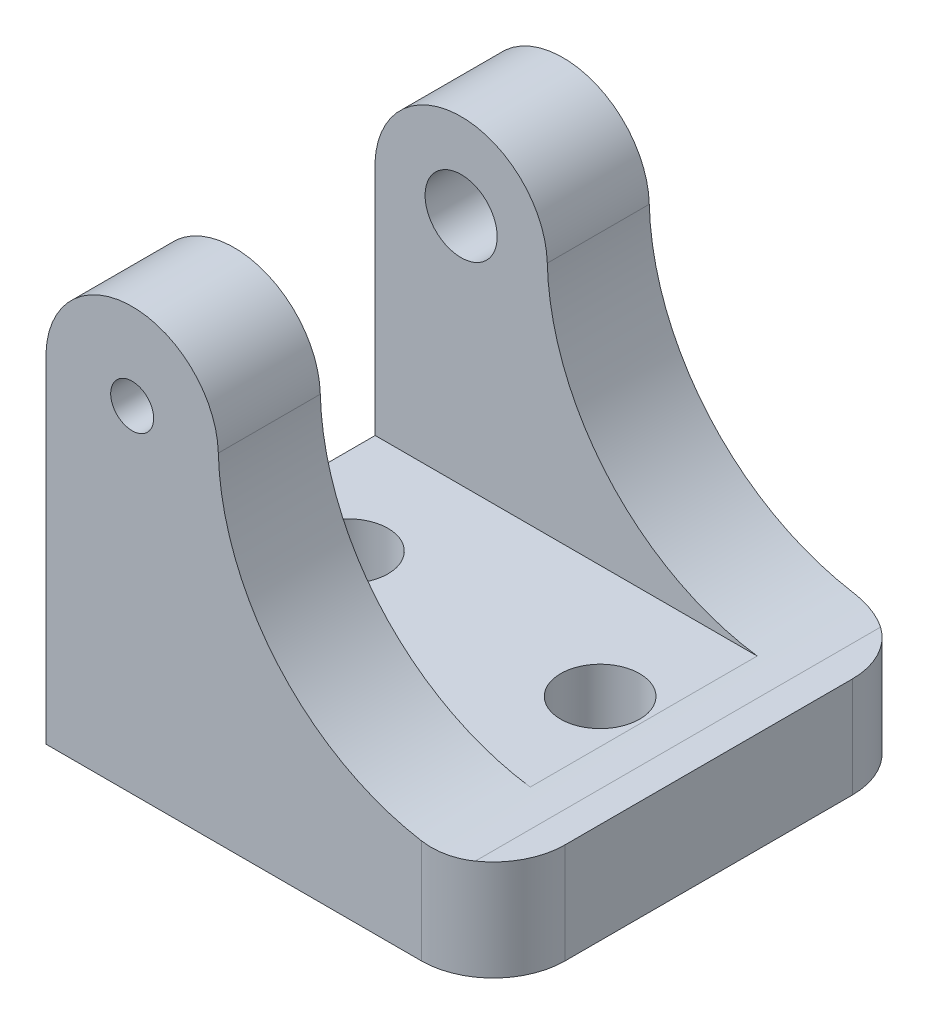
ISO-10303-21;
HEADER;
FILE_DESCRIPTION(('STEP AP214'),'2;1');
FILE_NAME('part.step','',(''),(''),'','','');
FILE_SCHEMA(('AUTOMOTIVE_DESIGN { 1 0 10303 214 1 1 1 1 }'));
ENDSEC;
DATA;
#1=APPLICATION_CONTEXT('core data for automotive mechanical design processes');
#2=APPLICATION_PROTOCOL_DEFINITION('international standard','automotive_design',2000,#1);
#3=PRODUCT_CONTEXT('',#1,'mechanical');
#4=PRODUCT('Part','Part','',(#3));
#5=PRODUCT_RELATED_PRODUCT_CATEGORY('part','',(#4));
#6=PRODUCT_DEFINITION_FORMATION('','',#4);
#7=PRODUCT_DEFINITION_CONTEXT('part definition',#1,'design');
#8=PRODUCT_DEFINITION('design','',#6,#7);
#9=PRODUCT_DEFINITION_SHAPE('','',#8);
#10=(LENGTH_UNIT() NAMED_UNIT(*) SI_UNIT(.MILLI.,.METRE.));
#11=(NAMED_UNIT(*) PLANE_ANGLE_UNIT() SI_UNIT($,.RADIAN.));
#12=(NAMED_UNIT(*) SI_UNIT($,.STERADIAN.) SOLID_ANGLE_UNIT());
#13=UNCERTAINTY_MEASURE_WITH_UNIT(LENGTH_MEASURE(1.E-05),#10,'distance_accuracy_value','');
#14=(GEOMETRIC_REPRESENTATION_CONTEXT(3) GLOBAL_UNCERTAINTY_ASSIGNED_CONTEXT((#13)) GLOBAL_UNIT_ASSIGNED_CONTEXT((#10,
#11,#12)) REPRESENTATION_CONTEXT('',''));
#15=CARTESIAN_POINT('',(0.,0.,0.));
#16=DIRECTION('',(0.,0.,1.));
#17=DIRECTION('',(1.,0.,0.));
#18=AXIS2_PLACEMENT_3D('',#15,#16,#17);
#19=CARTESIAN_POINT('',(-12.1624419840865,29.7023741953259,-38.1));
#20=DIRECTION('',(0.,0.,1.));
#21=DIRECTION('',(1.,0.,0.));
#22=AXIS2_PLACEMENT_3D('',#19,#20,#21);
#23=CYLINDRICAL_SURFACE('',#22,7.62);
#24=DIRECTION('',(0.,0.,1.));
#25=VECTOR('',#24,1.);
#26=CARTESIAN_POINT('',(-4.54514270780545,29.9052331008931,-38.1));
#27=LINE('',#26,#25);
#28=CARTESIAN_POINT('',(-4.54514270780545,29.9052331008931,-9.017));
#29=VERTEX_POINT('',#28);
#30=CARTESIAN_POINT('',(-4.54514270780545,29.9052331008931,0.));
#31=VERTEX_POINT('',#30);
#32=EDGE_CURVE('E193',#29,#31,#27,.T.);
#33=ORIENTED_EDGE('',*,*,#32,.F.);
#34=CARTESIAN_POINT('',(-12.1624419840865,29.7023741953259,-9.017));
#35=DIRECTION('',(0.,0.,1.));
#36=DIRECTION('',(0.,-1.,0.));
#37=AXIS2_PLACEMENT_3D('',#34,#35,#36);
#38=CIRCLE('',#37,7.62);
#39=CARTESIAN_POINT('',(-19.7612,29.1338,-9.017));
#40=VERTEX_POINT('',#39);
#41=EDGE_CURVE('E144',#40,#29,#38,.F.);
#42=ORIENTED_EDGE('',*,*,#41,.F.);
#43=DIRECTION('',(0.,0.,1.));
#44=VECTOR('',#43,1.);
#45=CARTESIAN_POINT('',(-19.7612,29.1338,-38.1));
#46=LINE('',#45,#44);
#47=CARTESIAN_POINT('',(-19.7612,29.1338,0.));
#48=VERTEX_POINT('',#47);
#49=EDGE_CURVE('E157',#40,#48,#46,.T.);
#50=ORIENTED_EDGE('',*,*,#49,.T.);
#51=CARTESIAN_POINT('',(-12.1624419840865,29.7023741953259,0.));
#52=DIRECTION('',(0.,0.,1.));
#53=DIRECTION('',(-1.,0.,0.));
#54=AXIS2_PLACEMENT_3D('',#51,#52,#53);
#55=CIRCLE('',#54,7.62);
#56=EDGE_CURVE('E170',#31,#48,#55,.T.);
#57=ORIENTED_EDGE('',*,*,#56,.F.);
#58=EDGE_LOOP('',(#33,#42,#50,#57));
#59=FACE_BOUND('',#58,.T.);
#60=ADVANCED_FACE('F40',(#59),#23,.T.);
#61=CARTESIAN_POINT('',(-19.7612,0.,-38.1));
#62=DIRECTION('',(-1.,0.,0.));
#63=DIRECTION('',(0.,0.,1.));
#64=AXIS2_PLACEMENT_3D('',#61,#62,#63);
#65=PLANE('',#64);
#66=DIRECTION('',(0.,-1.,0.));
#67=VECTOR('',#66,1.);
#68=CARTESIAN_POINT('',(-19.7612,0.,-29.083));
#69=LINE('',#68,#67);
#70=CARTESIAN_POINT('',(-19.7612,29.1338,-29.083));
#71=VERTEX_POINT('',#70);
#72=CARTESIAN_POINT('',(-19.7612,9.10297419532589,-29.083));
#73=VERTEX_POINT('',#72);
#74=EDGE_CURVE('E160',#71,#73,#69,.T.);
#75=ORIENTED_EDGE('',*,*,#74,.F.);
#76=CARTESIAN_POINT('',(-19.7612,29.1338,-38.1));
#77=VERTEX_POINT('',#76);
#78=EDGE_CURVE('E186',#77,#71,#46,.T.);
#79=ORIENTED_EDGE('',*,*,#78,.F.);
#80=DIRECTION('',(0.,-1.,0.));
#81=VECTOR('',#80,1.);
#82=CARTESIAN_POINT('',(-19.7612,0.,-38.1));
#83=LINE('',#82,#81);
#84=CARTESIAN_POINT('',(-19.7612,0.,-38.1));
#85=VERTEX_POINT('',#84);
#86=EDGE_CURVE('E166',#77,#85,#83,.T.);
#87=ORIENTED_EDGE('',*,*,#86,.T.);
#88=DIRECTION('',(0.,0.,1.));
#89=VECTOR('',#88,1.);
#90=CARTESIAN_POINT('',(-19.7612,0.,-38.1));
#91=LINE('',#90,#89);
#92=CARTESIAN_POINT('',(-19.7612,0.,0.));
#93=VERTEX_POINT('',#92);
#94=EDGE_CURVE('E177',#85,#93,#91,.T.);
#95=ORIENTED_EDGE('',*,*,#94,.T.);
#96=DIRECTION('',(0.,-1.,0.));
#97=VECTOR('',#96,1.);
#98=CARTESIAN_POINT('',(-19.7612,0.,0.));
#99=LINE('',#98,#97);
#100=EDGE_CURVE('E165',#48,#93,#99,.T.);
#101=ORIENTED_EDGE('',*,*,#100,.F.);
#102=ORIENTED_EDGE('',*,*,#49,.F.);
#103=DIRECTION('',(0.,1.,0.));
#104=VECTOR('',#103,1.);
#105=CARTESIAN_POINT('',(-19.7612,0.,-9.01699999999999));
#106=LINE('',#105,#104);
#107=CARTESIAN_POINT('',(-19.7612,9.10297419532589,-9.017));
#108=VERTEX_POINT('',#107);
#109=EDGE_CURVE('E148',#108,#40,#106,.T.);
#110=ORIENTED_EDGE('',*,*,#109,.F.);
#111=DIRECTION('',(0.,0.,1.));
#112=VECTOR('',#111,1.);
#113=CARTESIAN_POINT('',(-19.7612,9.10297419532589,-38.1));
#114=LINE('',#113,#112);
#115=EDGE_CURVE('E134',#73,#108,#114,.T.);
#116=ORIENTED_EDGE('',*,*,#115,.F.);
#117=EDGE_LOOP('',(#75,#79,#87,#95,#101,#102,#110,#116));
#118=FACE_BOUND('',#117,.T.);
#119=ADVANCED_FACE('F155',(#118),#65,.T.);
#120=CARTESIAN_POINT('',(-12.1624419840865,29.7023741953259,-29.083));
#121=DIRECTION('',(0.,0.,-1.));
#122=DIRECTION('',(-1.,0.,0.));
#123=AXIS2_PLACEMENT_3D('',#120,#121,#122);
#124=CIRCLE('',#123,7.62);
#125=CARTESIAN_POINT('',(-4.54514270780545,29.9052331008931,-29.083));
#126=VERTEX_POINT('',#125);
#127=EDGE_CURVE('E158',#126,#71,#124,.F.);
#128=ORIENTED_EDGE('',*,*,#127,.F.);
#129=CARTESIAN_POINT('',(-4.54514270780545,29.9052331008931,-38.1));
#130=VERTEX_POINT('',#129);
#131=EDGE_CURVE('E190',#130,#126,#27,.T.);
#132=ORIENTED_EDGE('',*,*,#131,.F.);
#133=CARTESIAN_POINT('',(-12.1624419840865,29.7023741953259,-38.1));
#134=DIRECTION('',(0.,0.,1.));
#135=DIRECTION('',(-1.,0.,0.));
#136=AXIS2_PLACEMENT_3D('',#133,#134,#135);
#137=CIRCLE('',#136,7.62);
#138=EDGE_CURVE('E174',#130,#77,#137,.T.);
#139=ORIENTED_EDGE('',*,*,#138,.T.);
#140=ORIENTED_EDGE('',*,*,#78,.T.);
#141=EDGE_LOOP('',(#128,#132,#139,#140));
#142=FACE_BOUND('',#141,.T.);
#143=ADVANCED_FACE('F249',(#142),#23,.T.);
#144=CARTESIAN_POINT('',(17.0372052416576,30.48,-38.1));
#145=DIRECTION('',(0.,0.,1.));
#146=DIRECTION('',(1.,0.,0.));
#147=AXIS2_PLACEMENT_3D('',#144,#145,#146);
#148=CYLINDRICAL_SURFACE('',#147,21.59);
#149=DIRECTION('',(0.,0.,1.));
#150=VECTOR('',#149,1.);
#151=CARTESIAN_POINT('',(17.0372052416576,8.89,-38.1));
#152=LINE('',#151,#150);
#153=CARTESIAN_POINT('',(17.0372052416576,8.89,-36.9629248975476));
#154=VERTEX_POINT('',#153);
#155=CARTESIAN_POINT('',(17.0372052416576,8.89,-1.1370751024524));
#156=VERTEX_POINT('',#155);
#157=EDGE_CURVE('E194',#154,#156,#152,.T.);
#158=ORIENTED_EDGE('',*,*,#157,.F.);
#159=CARTESIAN_POINT('',(17.0372052416576,8.89,-36.9629248975476));
#160=CARTESIAN_POINT('',(16.8931415028713,8.88998763684848,-37.063160770611));
#161=CARTESIAN_POINT('',(16.7448908878423,8.89144118584396,-37.157391085304));
#162=CARTESIAN_POINT('',(16.441141277506,8.89769845720492,-37.3332497352878));
#163=CARTESIAN_POINT('',(16.2856414930698,8.90250254510123,-37.4148766944144));
#164=CARTESIAN_POINT('',(15.9726522402385,8.91570640614745,-37.5629749658211));
#165=CARTESIAN_POINT('',(15.8153183028663,8.92400994811984,-37.6297837128549));
#166=CARTESIAN_POINT('',(15.496022299831,8.94448456826907,-37.750427239401));
#167=CARTESIAN_POINT('',(15.3340611026282,8.95665492499205,-37.8042644357979));
#168=CARTESIAN_POINT('',(15.0285847230403,8.98316744856153,-37.8923406938851));
#169=CARTESIAN_POINT('',(14.88550052542,8.99700124388347,-37.9282380772349));
#170=CARTESIAN_POINT('',(14.5975036183752,9.02779888671575,-37.9899415635191));
#171=CARTESIAN_POINT('',(14.4525909398653,9.04476268137232,-38.0157478368308));
#172=CARTESIAN_POINT('',(14.158378199001,9.08226849290067,-38.0576777652804));
#173=CARTESIAN_POINT('',(14.0090538461088,9.10288378645533,-38.0735652573884));
#174=CARTESIAN_POINT('',(13.7101272476129,9.14735785060343,-38.0947331159232));
#175=CARTESIAN_POINT('',(13.5605249869125,9.17121680280358,-38.1000128881811));
#176=CARTESIAN_POINT('',(13.4112,9.19666882305611,-38.1));
#177=B_SPLINE_CURVE_WITH_KNOTS('',3,(#159,#160,#161,#162,#163,#164,#165,#166,#167,#168,#169,
#170,#171,#172,#173,#174,#175,#176),.UNSPECIFIED.,.F.,.F.,(4,2,2,2,2,2,2,2,4),(0.,
0.526366836583321,1.05279110673478,1.56559737929597,2.0783080307723,2.5224270407601,
2.96653855195876,3.4208569174649,3.87520072993903),.UNSPECIFIED.);
#178=CARTESIAN_POINT('',(13.4112,9.19666882305611,-38.1));
#179=VERTEX_POINT('',#178);
#180=EDGE_CURVE('E237',#154,#179,#177,.T.);
#181=ORIENTED_EDGE('',*,*,#180,.T.);
#182=CARTESIAN_POINT('',(17.0372052416576,30.48,-38.1));
#183=DIRECTION('',(0.,0.,-1.));
#184=DIRECTION('',(1.,0.,0.));
#185=AXIS2_PLACEMENT_3D('',#182,#183,#184);
#186=CIRCLE('',#185,21.59);
#187=EDGE_CURVE('E172',#179,#130,#186,.T.);
#188=ORIENTED_EDGE('',*,*,#187,.T.);
#189=ORIENTED_EDGE('',*,*,#131,.T.);
#190=CARTESIAN_POINT('',(17.0372052416576,30.48,-29.083));
#191=DIRECTION('',(0.,0.,-1.));
#192=DIRECTION('',(-1.,0.,0.));
#193=AXIS2_PLACEMENT_3D('',#190,#191,#192);
#194=CIRCLE('',#193,21.59);
#195=CARTESIAN_POINT('',(14.0121651185686,9.10297419532591,-29.083));
#196=VERTEX_POINT('',#195);
#197=EDGE_CURVE('E205',#196,#126,#194,.T.);
#198=ORIENTED_EDGE('',*,*,#197,.F.);
#199=DIRECTION('',(0.,0.,1.));
#200=VECTOR('',#199,1.);
#201=CARTESIAN_POINT('',(14.0121651185686,9.10297419532591,-38.1));
#202=LINE('',#201,#200);
#203=CARTESIAN_POINT('',(14.0121651185686,9.10297419532591,-9.017));
#204=VERTEX_POINT('',#203);
#205=EDGE_CURVE('E189',#204,#196,#202,.F.);
#206=ORIENTED_EDGE('',*,*,#205,.F.);
#207=CARTESIAN_POINT('',(17.0372052416576,30.48,-9.017));
#208=DIRECTION('',(0.,0.,1.));
#209=DIRECTION('',(0.,-1.,0.));
#210=AXIS2_PLACEMENT_3D('',#207,#208,#209);
#211=CIRCLE('',#210,21.59);
#212=EDGE_CURVE('E151',#29,#204,#211,.T.);
#213=ORIENTED_EDGE('',*,*,#212,.F.);
#214=ORIENTED_EDGE('',*,*,#32,.T.);
#215=CARTESIAN_POINT('',(17.0372052416576,30.48,0.));
#216=DIRECTION('',(0.,0.,-1.));
#217=DIRECTION('',(1.,0.,0.));
#218=AXIS2_PLACEMENT_3D('',#215,#216,#217);
#219=CIRCLE('',#218,21.59);
#220=CARTESIAN_POINT('',(13.4112,9.19666882305611,0.));
#221=VERTEX_POINT('',#220);
#222=EDGE_CURVE('E182',#221,#31,#219,.T.);
#223=ORIENTED_EDGE('',*,*,#222,.F.);
#224=CARTESIAN_POINT('',(13.4112,9.19666882305611,0.));
#225=CARTESIAN_POINT('',(13.5842252192535,9.1671693741161,2.40591076720246E-05));
#226=CARTESIAN_POINT('',(13.7576277541459,9.13981899073767,-0.00707109032502442));
#227=CARTESIAN_POINT('',(14.1039145829073,9.08948163111424,-0.0355127757351594));
#228=CARTESIAN_POINT('',(14.2767988191825,9.06649512329994,-0.0568608405510777));
#229=CARTESIAN_POINT('',(14.6162910369309,9.02549427447236,-0.113084783871374));
#230=CARTESIAN_POINT('',(14.7829457028252,9.00736671812725,-0.147596529410407));
#231=CARTESIAN_POINT('',(15.1132933508516,8.97525221329142,-0.230004618226908));
#232=CARTESIAN_POINT('',(15.2769868749063,8.96126449981516,-0.277898485490002));
#233=CARTESIAN_POINT('',(15.5785685800954,8.93887206641993,-0.379503076486314));
#234=CARTESIAN_POINT('',(15.716975332757,8.92997038229936,-0.431574293600448));
#235=CARTESIAN_POINT('',(15.989947420612,8.9149811792621,-0.545310187399221));
#236=CARTESIAN_POINT('',(16.1245128163144,8.90889361599443,-0.606974712871384));
#237=CARTESIAN_POINT('',(16.3921188431343,8.89921495807326,-0.74112073697719));
#238=CARTESIAN_POINT('',(16.5250533609667,8.89568445161754,-0.813818259128751));
#239=CARTESIAN_POINT('',(16.785430981764,8.89107364016084,-0.968546394018817));
#240=CARTESIAN_POINT('',(16.9128737472261,8.88999348553936,-1.05057757924517));
#241=CARTESIAN_POINT('',(17.0372052416576,8.89,-1.1370751024524));
#242=B_SPLINE_CURVE_WITH_KNOTS('',3,(#224,#225,#226,#227,#228,#229,#230,#231,#232,#233,#234,
#235,#236,#237,#238,#239,#240,#241),.UNSPECIFIED.,.F.,.F.,(4,2,2,2,2,2,2,2,4),(0.,
0.52642632669727,1.05290912957047,1.56577610101067,2.07854824249167,2.52260711440877,
2.96665898765166,3.42091591287959,3.87520071536177),.UNSPECIFIED.);
#243=EDGE_CURVE('E230',#221,#156,#242,.T.);
#244=ORIENTED_EDGE('',*,*,#243,.T.);
#245=EDGE_LOOP('',(#158,#181,#188,#189,#198,#206,#213,#214,#223,#244));
#246=FACE_BOUND('',#245,.T.);
#247=ADVANCED_FACE('F243',(#246),#148,.F.);
#248=CARTESIAN_POINT('',(17.0372052416576,8.89,-38.1));
#249=DIRECTION('',(0.,1.,0.));
#250=DIRECTION('',(-1.,0.,0.));
#251=AXIS2_PLACEMENT_3D('',#248,#249,#250);
#252=PLANE('',#251);
#253=DIRECTION('',(0.,0.,1.));
#254=VECTOR('',#253,1.);
#255=CARTESIAN_POINT('',(19.7612,8.89,-38.1));
#256=LINE('',#255,#254);
#257=CARTESIAN_POINT('',(19.7612,8.89,-31.75));
#258=VERTEX_POINT('',#257);
#259=CARTESIAN_POINT('',(19.7612,8.89,-6.35000000000002));
#260=VERTEX_POINT('',#259);
#261=EDGE_CURVE('E197',#258,#260,#256,.T.);
#262=ORIENTED_EDGE('',*,*,#261,.F.);
#263=CARTESIAN_POINT('',(13.4112,8.89,-31.75));
#264=DIRECTION('',(0.,1.,0.));
#265=DIRECTION('',(-1.,0.,0.));
#266=AXIS2_PLACEMENT_3D('',#263,#264,#265);
#267=CIRCLE('',#266,6.35);
#268=EDGE_CURVE('E228',#258,#154,#267,.T.);
#269=ORIENTED_EDGE('',*,*,#268,.T.);
#270=ORIENTED_EDGE('',*,*,#157,.T.);
#271=CARTESIAN_POINT('',(13.4112,8.89,-6.35));
#272=DIRECTION('',(0.,1.,0.));
#273=DIRECTION('',(-1.,0.,0.));
#274=AXIS2_PLACEMENT_3D('',#271,#272,#273);
#275=CIRCLE('',#274,6.35);
#276=EDGE_CURVE('E226',#156,#260,#275,.T.);
#277=ORIENTED_EDGE('',*,*,#276,.T.);
#278=EDGE_LOOP('',(#262,#269,#270,#277));
#279=FACE_BOUND('',#278,.T.);
#280=ADVANCED_FACE('F248',(#279),#252,.T.);
#281=CARTESIAN_POINT('',(19.7612,8.89,-38.1));
#282=DIRECTION('',(1.,0.,0.));
#283=DIRECTION('',(0.,1.,0.));
#284=AXIS2_PLACEMENT_3D('',#281,#282,#283);
#285=PLANE('',#284);
#286=DIRECTION('',(0.,0.,1.));
#287=VECTOR('',#286,1.);
#288=CARTESIAN_POINT('',(19.7612,0.,-38.1));
#289=LINE('',#288,#287);
#290=CARTESIAN_POINT('',(19.7612,0.,-31.75));
#291=VERTEX_POINT('',#290);
#292=CARTESIAN_POINT('',(19.7612,0.,-6.35000000000002));
#293=VERTEX_POINT('',#292);
#294=EDGE_CURVE('E200',#291,#293,#289,.T.);
#295=ORIENTED_EDGE('',*,*,#294,.F.);
#296=DIRECTION('',(0.,1.,0.));
#297=VECTOR('',#296,1.);
#298=CARTESIAN_POINT('',(19.7612,8.89,-31.75));
#299=LINE('',#298,#297);
#300=EDGE_CURVE('E223',#291,#258,#299,.T.);
#301=ORIENTED_EDGE('',*,*,#300,.T.);
#302=ORIENTED_EDGE('',*,*,#261,.T.);
#303=DIRECTION('',(0.,1.,0.));
#304=VECTOR('',#303,1.);
#305=CARTESIAN_POINT('',(19.7612,0.,-6.35));
#306=LINE('',#305,#304);
#307=EDGE_CURVE('E208',#260,#293,#306,.F.);
#308=ORIENTED_EDGE('',*,*,#307,.T.);
#309=EDGE_LOOP('',(#295,#301,#302,#308));
#310=FACE_BOUND('',#309,.T.);
#311=ADVANCED_FACE('F255',(#310),#285,.T.);
#312=CARTESIAN_POINT('',(-19.7612,0.,-38.1));
#313=DIRECTION('',(0.,-1.,0.));
#314=DIRECTION('',(1.,0.,0.));
#315=AXIS2_PLACEMENT_3D('',#312,#313,#314);
#316=PLANE('',#315);
#317=CARTESIAN_POINT('',(10.16,0.,-19.05));
#318=DIRECTION('',(0.,-1.,0.));
#319=DIRECTION('',(1.,0.,0.));
#320=AXIS2_PLACEMENT_3D('',#317,#318,#319);
#321=CIRCLE('',#320,3.4925);
#322=CARTESIAN_POINT('',(13.6525,0.,-19.05));
#323=VERTEX_POINT('',#322);
#324=EDGE_CURVE('E221',#323,#323,#321,.T.);
#325=ORIENTED_EDGE('',*,*,#324,.F.);
#326=EDGE_LOOP('',(#325));
#327=FACE_BOUND('',#326,.T.);
#328=CARTESIAN_POINT('',(-12.0904,0.,-19.05));
#329=DIRECTION('',(0.,-1.,0.));
#330=DIRECTION('',(1.,0.,0.));
#331=AXIS2_PLACEMENT_3D('',#328,#329,#330);
#332=CIRCLE('',#331,3.4925);
#333=CARTESIAN_POINT('',(-8.5979,0.,-19.05));
#334=VERTEX_POINT('',#333);
#335=EDGE_CURVE('E217',#334,#334,#332,.T.);
#336=ORIENTED_EDGE('',*,*,#335,.F.);
#337=EDGE_LOOP('',(#336));
#338=FACE_BOUND('',#337,.T.);
#339=DIRECTION('',(1.,0.,0.));
#340=VECTOR('',#339,1.);
#341=CARTESIAN_POINT('',(-19.7612,0.,-38.1));
#342=LINE('',#341,#340);
#343=CARTESIAN_POINT('',(13.4112,0.,-38.1));
#344=VERTEX_POINT('',#343);
#345=EDGE_CURVE('E169',#85,#344,#342,.T.);
#346=ORIENTED_EDGE('',*,*,#345,.T.);
#347=CARTESIAN_POINT('',(13.4112,0.,-31.75));
#348=DIRECTION('',(0.,-1.,0.));
#349=DIRECTION('',(1.,0.,0.));
#350=AXIS2_PLACEMENT_3D('',#347,#348,#349);
#351=CIRCLE('',#350,6.35);
#352=EDGE_CURVE('E49',#344,#291,#351,.T.);
#353=ORIENTED_EDGE('',*,*,#352,.T.);
#354=ORIENTED_EDGE('',*,*,#294,.T.);
#355=CARTESIAN_POINT('',(13.4112,0.,-6.35));
#356=DIRECTION('',(0.,-1.,0.));
#357=DIRECTION('',(1.,0.,0.));
#358=AXIS2_PLACEMENT_3D('',#355,#356,#357);
#359=CIRCLE('',#358,6.35);
#360=CARTESIAN_POINT('',(13.4112,0.,0.));
#361=VERTEX_POINT('',#360);
#362=EDGE_CURVE('E56',#293,#361,#359,.T.);
#363=ORIENTED_EDGE('',*,*,#362,.T.);
#364=DIRECTION('',(1.,0.,0.));
#365=VECTOR('',#364,1.);
#366=CARTESIAN_POINT('',(-19.7612,0.,0.));
#367=LINE('',#366,#365);
#368=EDGE_CURVE('E180',#93,#361,#367,.T.);
#369=ORIENTED_EDGE('',*,*,#368,.F.);
#370=ORIENTED_EDGE('',*,*,#94,.F.);
#371=EDGE_LOOP('',(#346,#353,#354,#363,#369,#370));
#372=FACE_BOUND('',#371,.T.);
#373=ADVANCED_FACE('F259',(#327,#338,#372),#316,.T.);
#374=CARTESIAN_POINT('',(-12.1624419840865,29.7023741953259,-38.1));
#375=DIRECTION('',(0.,0.,-1.));
#376=DIRECTION('',(-1.,0.,0.));
#377=AXIS2_PLACEMENT_3D('',#374,#375,#376);
#378=PLANE('',#377);
#379=CARTESIAN_POINT('',(-12.1624419840865,29.7023741953259,-38.1));
#380=DIRECTION('',(0.,0.,-1.));
#381=DIRECTION('',(-1.,0.,0.));
#382=AXIS2_PLACEMENT_3D('',#379,#380,#381);
#383=CIRCLE('',#382,5.1308);
#384=CARTESIAN_POINT('',(-17.2932419840865,29.7023741953259,-38.1));
#385=VERTEX_POINT('',#384);
#386=EDGE_CURVE('E216',#385,#385,#383,.T.);
#387=ORIENTED_EDGE('',*,*,#386,.F.);
#388=EDGE_LOOP('',(#387));
#389=FACE_BOUND('',#388,.T.);
#390=ORIENTED_EDGE('',*,*,#187,.F.);
#391=DIRECTION('',(0.,1.,0.));
#392=VECTOR('',#391,1.);
#393=CARTESIAN_POINT('',(13.4112,29.7023741953259,-38.1));
#394=LINE('',#393,#392);
#395=EDGE_CURVE('E64',#179,#344,#394,.F.);
#396=ORIENTED_EDGE('',*,*,#395,.T.);
#397=ORIENTED_EDGE('',*,*,#345,.F.);
#398=ORIENTED_EDGE('',*,*,#86,.F.);
#399=ORIENTED_EDGE('',*,*,#138,.F.);
#400=EDGE_LOOP('',(#390,#396,#397,#398,#399));
#401=FACE_BOUND('',#400,.T.);
#402=ADVANCED_FACE('F263',(#389,#401),#378,.T.);
#403=CARTESIAN_POINT('',(-12.1624419840865,29.7023741953259,0.));
#404=DIRECTION('',(0.,0.,-1.));
#405=DIRECTION('',(-1.,0.,0.));
#406=AXIS2_PLACEMENT_3D('',#403,#404,#405);
#407=PLANE('',#406);
#408=CARTESIAN_POINT('',(-12.1624419840865,29.7023741953259,0.));
#409=DIRECTION('',(0.,0.,1.));
#410=DIRECTION('',(1.,0.,0.));
#411=AXIS2_PLACEMENT_3D('',#408,#409,#410);
#412=CIRCLE('',#411,1.89864999999999);
#413=CARTESIAN_POINT('',(-10.2637919840865,29.7023741953259,0.));
#414=VERTEX_POINT('',#413);
#415=EDGE_CURVE('E212',#414,#414,#412,.T.);
#416=ORIENTED_EDGE('',*,*,#415,.F.);
#417=EDGE_LOOP('',(#416));
#418=FACE_BOUND('',#417,.T.);
#419=ORIENTED_EDGE('',*,*,#368,.T.);
#420=DIRECTION('',(0.,1.,0.));
#421=VECTOR('',#420,1.);
#422=CARTESIAN_POINT('',(13.4112,8.89,0.));
#423=LINE('',#422,#421);
#424=EDGE_CURVE('E11',#361,#221,#423,.T.);
#425=ORIENTED_EDGE('',*,*,#424,.T.);
#426=ORIENTED_EDGE('',*,*,#222,.T.);
#427=ORIENTED_EDGE('',*,*,#56,.T.);
#428=ORIENTED_EDGE('',*,*,#100,.T.);
#429=EDGE_LOOP('',(#419,#425,#426,#427,#428));
#430=FACE_BOUND('',#429,.T.);
#431=ADVANCED_FACE('F307',(#418,#430),#407,.F.);
#432=CARTESIAN_POINT('',(19.7612,9.10297419532592,-29.083));
#433=DIRECTION('',(0.,0.,-1.));
#434=DIRECTION('',(-1.,0.,0.));
#435=AXIS2_PLACEMENT_3D('',#432,#433,#434);
#436=PLANE('',#435);
#437=CARTESIAN_POINT('',(-12.1624419840865,29.7023741953259,-29.083));
#438=DIRECTION('',(0.,0.,-1.));
#439=DIRECTION('',(-1.,0.,0.));
#440=AXIS2_PLACEMENT_3D('',#437,#438,#439);
#441=CIRCLE('',#440,3.1877);
#442=CARTESIAN_POINT('',(-15.3501419840865,29.7023741953259,-29.083));
#443=VERTEX_POINT('',#442);
#444=EDGE_CURVE('E364',#443,#443,#441,.T.);
#445=ORIENTED_EDGE('',*,*,#444,.T.);
#446=EDGE_LOOP('',(#445));
#447=FACE_BOUND('',#446,.T.);
#448=ORIENTED_EDGE('',*,*,#74,.T.);
#449=DIRECTION('',(-1.,0.,0.));
#450=VECTOR('',#449,1.);
#451=CARTESIAN_POINT('',(19.7612,9.10297419532592,-29.083));
#452=LINE('',#451,#450);
#453=EDGE_CURVE('E140',#196,#73,#452,.T.);
#454=ORIENTED_EDGE('',*,*,#453,.F.);
#455=ORIENTED_EDGE('',*,*,#197,.T.);
#456=ORIENTED_EDGE('',*,*,#127,.T.);
#457=EDGE_LOOP('',(#448,#454,#455,#456));
#458=FACE_BOUND('',#457,.T.);
#459=ADVANCED_FACE('F293',(#447,#458),#436,.F.);
#460=CARTESIAN_POINT('',(19.7612,37.3223741953259,-9.017));
#461=DIRECTION('',(0.,0.,1.));
#462=DIRECTION('',(0.,-1.,0.));
#463=AXIS2_PLACEMENT_3D('',#460,#461,#462);
#464=PLANE('',#463);
#465=CARTESIAN_POINT('',(-12.1624419840865,29.7023741953259,-9.017));
#466=DIRECTION('',(0.,0.,1.));
#467=DIRECTION('',(0.,-1.,0.));
#468=AXIS2_PLACEMENT_3D('',#465,#466,#467);
#469=CIRCLE('',#468,1.89864999999999);
#470=CARTESIAN_POINT('',(-12.1624419840865,27.8037241953259,-9.017));
#471=VERTEX_POINT('',#470);
#472=EDGE_CURVE('E209',#471,#471,#469,.T.);
#473=ORIENTED_EDGE('',*,*,#472,.T.);
#474=EDGE_LOOP('',(#473));
#475=FACE_BOUND('',#474,.T.);
#476=ORIENTED_EDGE('',*,*,#109,.T.);
#477=ORIENTED_EDGE('',*,*,#41,.T.);
#478=ORIENTED_EDGE('',*,*,#212,.T.);
#479=DIRECTION('',(-1.,0.,0.));
#480=VECTOR('',#479,1.);
#481=CARTESIAN_POINT('',(19.7612,9.10297419532592,-9.017));
#482=LINE('',#481,#480);
#483=EDGE_CURVE('E137',#204,#108,#482,.T.);
#484=ORIENTED_EDGE('',*,*,#483,.T.);
#485=EDGE_LOOP('',(#476,#477,#478,#484));
#486=FACE_BOUND('',#485,.T.);
#487=ADVANCED_FACE('F147',(#475,#486),#464,.F.);
#488=CARTESIAN_POINT('',(19.7612,9.10297419532592,-9.017));
#489=DIRECTION('',(0.,-1.,0.));
#490=DIRECTION('',(1.,0.,0.));
#491=AXIS2_PLACEMENT_3D('',#488,#489,#490);
#492=PLANE('',#491);
#493=CARTESIAN_POINT('',(10.16,9.10297419532591,-19.05));
#494=DIRECTION('',(0.,-1.,0.));
#495=DIRECTION('',(1.,0.,0.));
#496=AXIS2_PLACEMENT_3D('',#493,#494,#495);
#497=CIRCLE('',#496,3.4925);
#498=CARTESIAN_POINT('',(13.6525,9.10297419532591,-19.05));
#499=VERTEX_POINT('',#498);
#500=EDGE_CURVE('E218',#499,#499,#497,.T.);
#501=ORIENTED_EDGE('',*,*,#500,.T.);
#502=EDGE_LOOP('',(#501));
#503=FACE_BOUND('',#502,.T.);
#504=CARTESIAN_POINT('',(-12.0904,9.1029741953259,-19.05));
#505=DIRECTION('',(0.,-1.,0.));
#506=DIRECTION('',(1.,0.,0.));
#507=AXIS2_PLACEMENT_3D('',#504,#505,#506);
#508=CIRCLE('',#507,3.4925);
#509=CARTESIAN_POINT('',(-8.59790000000001,9.1029741953259,-19.05));
#510=VERTEX_POINT('',#509);
#511=EDGE_CURVE('E213',#510,#510,#508,.T.);
#512=ORIENTED_EDGE('',*,*,#511,.T.);
#513=EDGE_LOOP('',(#512));
#514=FACE_BOUND('',#513,.T.);
#515=ORIENTED_EDGE('',*,*,#115,.T.);
#516=ORIENTED_EDGE('',*,*,#483,.F.);
#517=ORIENTED_EDGE('',*,*,#205,.T.);
#518=ORIENTED_EDGE('',*,*,#453,.T.);
#519=EDGE_LOOP('',(#515,#516,#517,#518));
#520=FACE_BOUND('',#519,.T.);
#521=ADVANCED_FACE('F136',(#503,#514,#520),#492,.F.);
#522=CARTESIAN_POINT('',(-12.1624419840865,29.7023741953259,0.));
#523=DIRECTION('',(0.,0.,1.));
#524=DIRECTION('',(1.,0.,0.));
#525=AXIS2_PLACEMENT_3D('',#522,#523,#524);
#526=CYLINDRICAL_SURFACE('',#525,1.89864999999999);
#527=ORIENTED_EDGE('',*,*,#415,.T.);
#528=EDGE_LOOP('',(#527));
#529=FACE_BOUND('',#528,.T.);
#530=ORIENTED_EDGE('',*,*,#472,.F.);
#531=EDGE_LOOP('',(#530));
#532=FACE_BOUND('',#531,.T.);
#533=ADVANCED_FACE('F323',(#529,#532),#526,.F.);
#534=CARTESIAN_POINT('',(-12.1624419840865,29.7023741953259,-38.1));
#535=DIRECTION('',(0.,0.,-1.));
#536=DIRECTION('',(-1.,0.,0.));
#537=AXIS2_PLACEMENT_3D('',#534,#535,#536);
#538=CYLINDRICAL_SURFACE('',#537,3.1877);
#539=ORIENTED_EDGE('',*,*,#444,.F.);
#540=EDGE_LOOP('',(#539));
#541=FACE_BOUND('',#540,.T.);
#542=CARTESIAN_POINT('',(-12.1624419840865,29.7023741953259,-34.2138));
#543=DIRECTION('',(0.,0.,-1.));
#544=DIRECTION('',(-1.,0.,0.));
#545=AXIS2_PLACEMENT_3D('',#542,#543,#544);
#546=CIRCLE('',#545,3.1877);
#547=CARTESIAN_POINT('',(-15.3501419840865,29.7023741953259,-34.2138));
#548=VERTEX_POINT('',#547);
#549=EDGE_CURVE('E361',#548,#548,#546,.T.);
#550=ORIENTED_EDGE('',*,*,#549,.T.);
#551=EDGE_LOOP('',(#550));
#552=FACE_BOUND('',#551,.T.);
#553=ADVANCED_FACE('F330',(#541,#552),#538,.F.);
#554=CARTESIAN_POINT('',(-8.97474198408651,29.7023741953259,-34.2138));
#555=DIRECTION('',(0.,0.,1.));
#556=DIRECTION('',(1.,0.,0.));
#557=AXIS2_PLACEMENT_3D('',#554,#555,#556);
#558=PLANE('',#557);
#559=ORIENTED_EDGE('',*,*,#549,.F.);
#560=EDGE_LOOP('',(#559));
#561=FACE_BOUND('',#560,.T.);
#562=CARTESIAN_POINT('',(-12.1624419840865,29.7023741953259,-34.2138));
#563=DIRECTION('',(0.,0.,-1.));
#564=DIRECTION('',(-1.,0.,0.));
#565=AXIS2_PLACEMENT_3D('',#562,#563,#564);
#566=CIRCLE('',#565,5.1308);
#567=CARTESIAN_POINT('',(-17.2932419840865,29.7023741953259,-34.2138));
#568=VERTEX_POINT('',#567);
#569=EDGE_CURVE('E358',#568,#568,#566,.T.);
#570=ORIENTED_EDGE('',*,*,#569,.T.);
#571=EDGE_LOOP('',(#570));
#572=FACE_BOUND('',#571,.T.);
#573=ADVANCED_FACE('F334',(#561,#572),#558,.F.);
#574=CARTESIAN_POINT('',(-12.1624419840865,29.7023741953259,-38.1));
#575=DIRECTION('',(0.,0.,-1.));
#576=DIRECTION('',(-1.,0.,0.));
#577=AXIS2_PLACEMENT_3D('',#574,#575,#576);
#578=CYLINDRICAL_SURFACE('',#577,5.1308);
#579=ORIENTED_EDGE('',*,*,#569,.F.);
#580=EDGE_LOOP('',(#579));
#581=FACE_BOUND('',#580,.T.);
#582=ORIENTED_EDGE('',*,*,#386,.T.);
#583=EDGE_LOOP('',(#582));
#584=FACE_BOUND('',#583,.T.);
#585=ADVANCED_FACE('F338',(#581,#584),#578,.F.);
#586=CARTESIAN_POINT('',(-12.0904,37.3223741953259,-19.05));
#587=DIRECTION('',(0.,-1.,0.));
#588=DIRECTION('',(1.,0.,0.));
#589=AXIS2_PLACEMENT_3D('',#586,#587,#588);
#590=CYLINDRICAL_SURFACE('',#589,3.4925);
#591=ORIENTED_EDGE('',*,*,#335,.T.);
#592=EDGE_LOOP('',(#591));
#593=FACE_BOUND('',#592,.T.);
#594=ORIENTED_EDGE('',*,*,#511,.F.);
#595=EDGE_LOOP('',(#594));
#596=FACE_BOUND('',#595,.T.);
#597=ADVANCED_FACE('F276',(#593,#596),#590,.F.);
#598=CARTESIAN_POINT('',(10.16,37.3223741953259,-19.05));
#599=DIRECTION('',(0.,-1.,0.));
#600=DIRECTION('',(1.,0.,0.));
#601=AXIS2_PLACEMENT_3D('',#598,#599,#600);
#602=CYLINDRICAL_SURFACE('',#601,3.4925);
#603=ORIENTED_EDGE('',*,*,#324,.T.);
#604=EDGE_LOOP('',(#603));
#605=FACE_BOUND('',#604,.T.);
#606=ORIENTED_EDGE('',*,*,#500,.F.);
#607=EDGE_LOOP('',(#606));
#608=FACE_BOUND('',#607,.T.);
#609=ADVANCED_FACE('F269',(#605,#608),#602,.F.);
#610=CARTESIAN_POINT('',(13.4112,8.89,-31.75));
#611=DIRECTION('',(0.,1.,0.));
#612=DIRECTION('',(-1.,0.,0.));
#613=AXIS2_PLACEMENT_3D('',#610,#611,#612);
#614=CYLINDRICAL_SURFACE('',#613,6.35);
#615=ORIENTED_EDGE('',*,*,#352,.F.);
#616=ORIENTED_EDGE('',*,*,#395,.F.);
#617=ORIENTED_EDGE('',*,*,#180,.F.);
#618=ORIENTED_EDGE('',*,*,#268,.F.);
#619=ORIENTED_EDGE('',*,*,#300,.F.);
#620=EDGE_LOOP('',(#615,#616,#617,#618,#619));
#621=FACE_BOUND('',#620,.T.);
#622=ADVANCED_FACE('F266',(#621),#614,.T.);
#623=CARTESIAN_POINT('',(13.4112,29.7023741953259,-6.35));
#624=DIRECTION('',(0.,-1.,0.));
#625=DIRECTION('',(1.,0.,0.));
#626=AXIS2_PLACEMENT_3D('',#623,#624,#625);
#627=CYLINDRICAL_SURFACE('',#626,6.35);
#628=ORIENTED_EDGE('',*,*,#362,.F.);
#629=ORIENTED_EDGE('',*,*,#307,.F.);
#630=ORIENTED_EDGE('',*,*,#276,.F.);
#631=ORIENTED_EDGE('',*,*,#243,.F.);
#632=ORIENTED_EDGE('',*,*,#424,.F.);
#633=EDGE_LOOP('',(#628,#629,#630,#631,#632));
#634=FACE_BOUND('',#633,.T.);
#635=ADVANCED_FACE('F42',(#634),#627,.T.);
#636=CLOSED_SHELL('',(#60,#119,#143,#247,#280,#311,#373,#402,#431,#459,#487,#521,#533,#553,#573,
#585,#597,#609,#622,#635));
#637=MANIFOLD_SOLID_BREP('B2',#636);
#638=ADVANCED_BREP_SHAPE_REPRESENTATION('',(#18,#637),#14);
#639=SHAPE_DEFINITION_REPRESENTATION(#9,#638);
ENDSEC;
END-ISO-10303-21;
